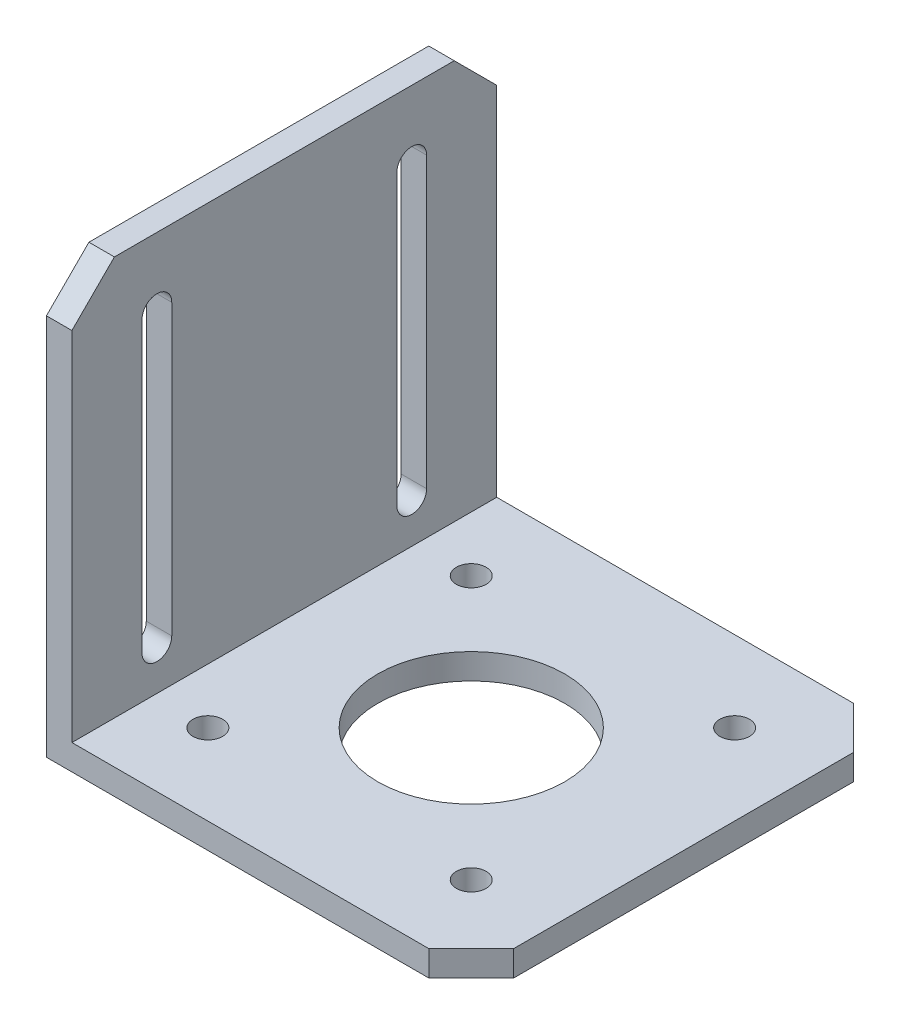
ISO-10303-21;
HEADER;
FILE_DESCRIPTION(('STEP AP214'),'2;1');
FILE_NAME('part.step','',(''),(''),'','','');
FILE_SCHEMA(('AUTOMOTIVE_DESIGN { 1 0 10303 214 1 1 1 1 }'));
ENDSEC;
DATA;
#1=APPLICATION_CONTEXT('core data for automotive mechanical design processes');
#2=APPLICATION_PROTOCOL_DEFINITION('international standard','automotive_design',2000,#1);
#3=PRODUCT_CONTEXT('',#1,'mechanical');
#4=PRODUCT('Part','Part','',(#3));
#5=PRODUCT_RELATED_PRODUCT_CATEGORY('part','',(#4));
#6=PRODUCT_DEFINITION_FORMATION('','',#4);
#7=PRODUCT_DEFINITION_CONTEXT('part definition',#1,'design');
#8=PRODUCT_DEFINITION('design','',#6,#7);
#9=PRODUCT_DEFINITION_SHAPE('','',#8);
#10=(LENGTH_UNIT() NAMED_UNIT(*) SI_UNIT(.MILLI.,.METRE.));
#11=(NAMED_UNIT(*) PLANE_ANGLE_UNIT() SI_UNIT($,.RADIAN.));
#12=(NAMED_UNIT(*) SI_UNIT($,.STERADIAN.) SOLID_ANGLE_UNIT());
#13=UNCERTAINTY_MEASURE_WITH_UNIT(LENGTH_MEASURE(1.E-05),#10,'distance_accuracy_value','');
#14=(GEOMETRIC_REPRESENTATION_CONTEXT(3) GLOBAL_UNCERTAINTY_ASSIGNED_CONTEXT((#13)) GLOBAL_UNIT_ASSIGNED_CONTEXT((#10,
#11,#12)) REPRESENTATION_CONTEXT('',''));
#15=CARTESIAN_POINT('',(0.,0.,0.));
#16=DIRECTION('',(0.,0.,1.));
#17=DIRECTION('',(1.,0.,0.));
#18=AXIS2_PLACEMENT_3D('',#15,#16,#17);
#19=CARTESIAN_POINT('',(0.,3.,0.));
#20=DIRECTION('',(0.,-1.,0.));
#21=DIRECTION('',(0.,0.,-1.));
#22=AXIS2_PLACEMENT_3D('',#19,#20,#21);
#23=PLANE('',#22);
#24=CARTESIAN_POINT('',(40.5000000000006,3.,-9.50000000000001));
#25=DIRECTION('',(0.,1.,0.));
#26=DIRECTION('',(0.,0.,1.));
#27=AXIS2_PLACEMENT_3D('',#24,#25,#26);
#28=CIRCLE('',#27,1.75);
#29=CARTESIAN_POINT('',(40.5000000000006,3.,-7.75));
#30=VERTEX_POINT('',#29);
#31=EDGE_CURVE('E244',#30,#30,#28,.T.);
#32=ORIENTED_EDGE('',*,*,#31,.F.);
#33=EDGE_LOOP('',(#32));
#34=FACE_BOUND('',#33,.T.);
#35=CARTESIAN_POINT('',(9.49999999999999,3.,-40.4999999999994));
#36=DIRECTION('',(0.,1.,0.));
#37=DIRECTION('',(0.,0.,1.));
#38=AXIS2_PLACEMENT_3D('',#35,#36,#37);
#39=CIRCLE('',#38,1.75000000000001);
#40=CARTESIAN_POINT('',(9.49999999999999,3.,-38.7499999999994));
#41=VERTEX_POINT('',#40);
#42=EDGE_CURVE('E594',#41,#41,#39,.T.);
#43=ORIENTED_EDGE('',*,*,#42,.F.);
#44=EDGE_LOOP('',(#43));
#45=FACE_BOUND('',#44,.T.);
#46=CARTESIAN_POINT('',(25.,3.,-25.));
#47=DIRECTION('',(0.,1.,0.));
#48=DIRECTION('',(0.,0.,1.));
#49=AXIS2_PLACEMENT_3D('',#46,#47,#48);
#50=CIRCLE('',#49,11.);
#51=CARTESIAN_POINT('',(25.,3.,-14.));
#52=VERTEX_POINT('',#51);
#53=EDGE_CURVE('E291',#52,#52,#50,.T.);
#54=ORIENTED_EDGE('',*,*,#53,.F.);
#55=EDGE_LOOP('',(#54));
#56=FACE_BOUND('',#55,.T.);
#57=CARTESIAN_POINT('',(40.5,3.,-40.5));
#58=DIRECTION('',(0.,1.,0.));
#59=DIRECTION('',(0.,0.,1.));
#60=AXIS2_PLACEMENT_3D('',#57,#58,#59);
#61=CIRCLE('',#60,1.75);
#62=CARTESIAN_POINT('',(40.5,3.,-38.75));
#63=VERTEX_POINT('',#62);
#64=EDGE_CURVE('E585',#63,#63,#61,.T.);
#65=ORIENTED_EDGE('',*,*,#64,.F.);
#66=EDGE_LOOP('',(#65));
#67=FACE_BOUND('',#66,.T.);
#68=CARTESIAN_POINT('',(9.50000000000058,3.,-9.49999999999942));
#69=DIRECTION('',(0.,1.,0.));
#70=DIRECTION('',(0.,0.,1.));
#71=AXIS2_PLACEMENT_3D('',#68,#69,#70);
#72=CIRCLE('',#71,1.75);
#73=CARTESIAN_POINT('',(9.50000000000058,3.,-7.74999999999942));
#74=VERTEX_POINT('',#73);
#75=EDGE_CURVE('E599',#74,#74,#72,.T.);
#76=ORIENTED_EDGE('',*,*,#75,.F.);
#77=EDGE_LOOP('',(#76));
#78=FACE_BOUND('',#77,.T.);
#79=DIRECTION('',(0.,0.,-1.));
#80=VECTOR('',#79,1.);
#81=CARTESIAN_POINT('',(50.,3.,0.));
#82=LINE('',#81,#80);
#83=CARTESIAN_POINT('',(50.,3.,-5.));
#84=VERTEX_POINT('',#83);
#85=CARTESIAN_POINT('',(50.,3.,-45.));
#86=VERTEX_POINT('',#85);
#87=EDGE_CURVE('E282',#84,#86,#82,.T.);
#88=ORIENTED_EDGE('',*,*,#87,.T.);
#89=DIRECTION('',(0.707106781186547,0.,0.707106781186549));
#90=VECTOR('',#89,1.);
#91=CARTESIAN_POINT('',(45.,3.,-50.));
#92=LINE('',#91,#90);
#93=CARTESIAN_POINT('',(45.,3.,-50.));
#94=VERTEX_POINT('',#93);
#95=EDGE_CURVE('E41',#86,#94,#92,.F.);
#96=ORIENTED_EDGE('',*,*,#95,.T.);
#97=DIRECTION('',(-1.,0.,0.));
#98=VECTOR('',#97,1.);
#99=CARTESIAN_POINT('',(0.,3.,-50.));
#100=LINE('',#99,#98);
#101=CARTESIAN_POINT('',(2.99999999999999,3.,-50.));
#102=VERTEX_POINT('',#101);
#103=EDGE_CURVE('E278',#94,#102,#100,.T.);
#104=ORIENTED_EDGE('',*,*,#103,.T.);
#105=DIRECTION('',(0.,0.,-1.));
#106=VECTOR('',#105,1.);
#107=CARTESIAN_POINT('',(2.99999999999999,3.,-50.));
#108=LINE('',#107,#106);
#109=CARTESIAN_POINT('',(2.99999999999999,3.,0.));
#110=VERTEX_POINT('',#109);
#111=EDGE_CURVE('E234',#110,#102,#108,.T.);
#112=ORIENTED_EDGE('',*,*,#111,.F.);
#113=DIRECTION('',(1.,0.,0.));
#114=VECTOR('',#113,1.);
#115=CARTESIAN_POINT('',(0.,3.,0.));
#116=LINE('',#115,#114);
#117=CARTESIAN_POINT('',(45.,3.,0.));
#118=VERTEX_POINT('',#117);
#119=EDGE_CURVE('E250',#110,#118,#116,.T.);
#120=ORIENTED_EDGE('',*,*,#119,.T.);
#121=DIRECTION('',(-0.707106781186548,0.,0.707106781186547));
#122=VECTOR('',#121,1.);
#123=CARTESIAN_POINT('',(50.,3.,-5.));
#124=LINE('',#123,#122);
#125=EDGE_CURVE('E350',#118,#84,#124,.F.);
#126=ORIENTED_EDGE('',*,*,#125,.T.);
#127=EDGE_LOOP('',(#88,#96,#104,#112,#120,#126));
#128=FACE_BOUND('',#127,.T.);
#129=ADVANCED_FACE('F33',(#34,#45,#56,#67,#78,#128),#23,.F.);
#130=CARTESIAN_POINT('',(0.,0.,0.));
#131=DIRECTION('',(0.,-1.,0.));
#132=DIRECTION('',(0.,0.,-1.));
#133=AXIS2_PLACEMENT_3D('',#130,#131,#132);
#134=PLANE('',#133);
#135=CARTESIAN_POINT('',(9.50000000000058,0.,-9.49999999999942));
#136=DIRECTION('',(0.,1.,0.));
#137=DIRECTION('',(0.,0.,1.));
#138=AXIS2_PLACEMENT_3D('',#135,#136,#137);
#139=CIRCLE('',#138,1.75);
#140=CARTESIAN_POINT('',(9.50000000000058,0.,-7.74999999999942));
#141=VERTEX_POINT('',#140);
#142=EDGE_CURVE('E602',#141,#141,#139,.T.);
#143=ORIENTED_EDGE('',*,*,#142,.T.);
#144=EDGE_LOOP('',(#143));
#145=FACE_BOUND('',#144,.T.);
#146=CARTESIAN_POINT('',(40.5,0.,-40.5));
#147=DIRECTION('',(0.,1.,0.));
#148=DIRECTION('',(0.,0.,1.));
#149=AXIS2_PLACEMENT_3D('',#146,#147,#148);
#150=CIRCLE('',#149,1.75);
#151=CARTESIAN_POINT('',(40.5,0.,-38.75));
#152=VERTEX_POINT('',#151);
#153=EDGE_CURVE('E589',#152,#152,#150,.T.);
#154=ORIENTED_EDGE('',*,*,#153,.T.);
#155=EDGE_LOOP('',(#154));
#156=FACE_BOUND('',#155,.T.);
#157=DIRECTION('',(-1.,0.,0.));
#158=VECTOR('',#157,1.);
#159=CARTESIAN_POINT('',(0.,0.,-50.));
#160=LINE('',#159,#158);
#161=CARTESIAN_POINT('',(45.,0.,-50.));
#162=VERTEX_POINT('',#161);
#163=CARTESIAN_POINT('',(0.,0.,-50.));
#164=VERTEX_POINT('',#163);
#165=EDGE_CURVE('E295',#162,#164,#160,.T.);
#166=ORIENTED_EDGE('',*,*,#165,.F.);
#167=DIRECTION('',(-0.707106781186547,0.,-0.707106781186549));
#168=VECTOR('',#167,1.);
#169=CARTESIAN_POINT('',(47.5000000000001,0.,-47.4999999999999));
#170=LINE('',#169,#168);
#171=CARTESIAN_POINT('',(50.,0.,-45.));
#172=VERTEX_POINT('',#171);
#173=EDGE_CURVE('E333',#162,#172,#170,.F.);
#174=ORIENTED_EDGE('',*,*,#173,.T.);
#175=DIRECTION('',(0.,0.,-1.));
#176=VECTOR('',#175,1.);
#177=CARTESIAN_POINT('',(50.,0.,0.));
#178=LINE('',#177,#176);
#179=CARTESIAN_POINT('',(50.,0.,-4.99999999999999));
#180=VERTEX_POINT('',#179);
#181=EDGE_CURVE('E293',#180,#172,#178,.T.);
#182=ORIENTED_EDGE('',*,*,#181,.F.);
#183=DIRECTION('',(0.707106781186548,0.,-0.707106781186547));
#184=VECTOR('',#183,1.);
#185=CARTESIAN_POINT('',(22.5,0.,22.5));
#186=LINE('',#185,#184);
#187=CARTESIAN_POINT('',(45.,0.,0.));
#188=VERTEX_POINT('',#187);
#189=EDGE_CURVE('E343',#180,#188,#186,.F.);
#190=ORIENTED_EDGE('',*,*,#189,.T.);
#191=DIRECTION('',(1.,0.,0.));
#192=VECTOR('',#191,1.);
#193=CARTESIAN_POINT('',(0.,0.,0.));
#194=LINE('',#193,#192);
#195=CARTESIAN_POINT('',(0.,0.,0.));
#196=VERTEX_POINT('',#195);
#197=EDGE_CURVE('E290',#196,#188,#194,.T.);
#198=ORIENTED_EDGE('',*,*,#197,.F.);
#199=DIRECTION('',(0.,0.,1.));
#200=VECTOR('',#199,1.);
#201=CARTESIAN_POINT('',(0.,0.,0.));
#202=LINE('',#201,#200);
#203=EDGE_CURVE('E287',#164,#196,#202,.T.);
#204=ORIENTED_EDGE('',*,*,#203,.F.);
#205=EDGE_LOOP('',(#166,#174,#182,#190,#198,#204));
#206=FACE_BOUND('',#205,.T.);
#207=CARTESIAN_POINT('',(25.,0.,-25.));
#208=DIRECTION('',(0.,1.,0.));
#209=DIRECTION('',(0.,0.,1.));
#210=AXIS2_PLACEMENT_3D('',#207,#208,#209);
#211=CIRCLE('',#210,11.);
#212=CARTESIAN_POINT('',(25.,0.,-14.));
#213=VERTEX_POINT('',#212);
#214=EDGE_CURVE('E584',#213,#213,#211,.T.);
#215=ORIENTED_EDGE('',*,*,#214,.T.);
#216=EDGE_LOOP('',(#215));
#217=FACE_BOUND('',#216,.T.);
#218=CARTESIAN_POINT('',(9.49999999999999,0.,-40.4999999999994));
#219=DIRECTION('',(0.,1.,0.));
#220=DIRECTION('',(0.,0.,1.));
#221=AXIS2_PLACEMENT_3D('',#218,#219,#220);
#222=CIRCLE('',#221,1.75000000000001);
#223=CARTESIAN_POINT('',(9.49999999999999,0.,-38.7499999999994));
#224=VERTEX_POINT('',#223);
#225=EDGE_CURVE('E596',#224,#224,#222,.T.);
#226=ORIENTED_EDGE('',*,*,#225,.T.);
#227=EDGE_LOOP('',(#226));
#228=FACE_BOUND('',#227,.T.);
#229=CARTESIAN_POINT('',(40.5000000000006,0.,-9.50000000000001));
#230=DIRECTION('',(0.,1.,0.));
#231=DIRECTION('',(0.,0.,1.));
#232=AXIS2_PLACEMENT_3D('',#229,#230,#231);
#233=CIRCLE('',#232,1.75);
#234=CARTESIAN_POINT('',(40.5000000000006,0.,-7.75));
#235=VERTEX_POINT('',#234);
#236=EDGE_CURVE('E264',#235,#235,#233,.T.);
#237=ORIENTED_EDGE('',*,*,#236,.T.);
#238=EDGE_LOOP('',(#237));
#239=FACE_BOUND('',#238,.T.);
#240=ADVANCED_FACE('F330',(#145,#156,#206,#217,#228,#239),#134,.T.);
#241=CARTESIAN_POINT('',(0.,3.,0.));
#242=DIRECTION('',(1.,0.,0.));
#243=DIRECTION('',(0.,0.,-1.));
#244=AXIS2_PLACEMENT_3D('',#241,#242,#243);
#245=PLANE('',#244);
#246=DIRECTION('',(0.,-1.,0.));
#247=VECTOR('',#246,1.);
#248=CARTESIAN_POINT('',(0.,42.,-11.75));
#249=LINE('',#248,#247);
#250=CARTESIAN_POINT('',(0.,42.,-11.75));
#251=VERTEX_POINT('',#250);
#252=CARTESIAN_POINT('',(0.,8.,-11.75));
#253=VERTEX_POINT('',#252);
#254=EDGE_CURVE('E188',#251,#253,#249,.T.);
#255=ORIENTED_EDGE('',*,*,#254,.F.);
#256=CARTESIAN_POINT('',(0.,42.,-10.));
#257=DIRECTION('',(-1.,0.,0.));
#258=DIRECTION('',(0.,0.,1.));
#259=AXIS2_PLACEMENT_3D('',#256,#257,#258);
#260=CIRCLE('',#259,1.75);
#261=CARTESIAN_POINT('',(0.,42.,-8.25));
#262=VERTEX_POINT('',#261);
#263=EDGE_CURVE('E167',#262,#251,#260,.T.);
#264=ORIENTED_EDGE('',*,*,#263,.F.);
#265=DIRECTION('',(0.,1.,0.));
#266=VECTOR('',#265,1.);
#267=CARTESIAN_POINT('',(0.,42.,-8.25));
#268=LINE('',#267,#266);
#269=CARTESIAN_POINT('',(0.,8.,-8.25));
#270=VERTEX_POINT('',#269);
#271=EDGE_CURVE('E172',#270,#262,#268,.T.);
#272=ORIENTED_EDGE('',*,*,#271,.F.);
#273=CARTESIAN_POINT('',(0.,8.,-10.));
#274=DIRECTION('',(-1.,0.,0.));
#275=DIRECTION('',(0.,0.,1.));
#276=AXIS2_PLACEMENT_3D('',#273,#274,#275);
#277=CIRCLE('',#276,1.75);
#278=EDGE_CURVE('E195',#253,#270,#277,.T.);
#279=ORIENTED_EDGE('',*,*,#278,.F.);
#280=EDGE_LOOP('',(#255,#264,#272,#279));
#281=FACE_BOUND('',#280,.T.);
#282=DIRECTION('',(0.,-1.,0.));
#283=VECTOR('',#282,1.);
#284=CARTESIAN_POINT('',(0.,42.,-41.75));
#285=LINE('',#284,#283);
#286=CARTESIAN_POINT('',(0.,42.,-41.75));
#287=VERTEX_POINT('',#286);
#288=CARTESIAN_POINT('',(0.,8.,-41.75));
#289=VERTEX_POINT('',#288);
#290=EDGE_CURVE('E213',#287,#289,#285,.T.);
#291=ORIENTED_EDGE('',*,*,#290,.F.);
#292=CARTESIAN_POINT('',(0.,42.,-40.));
#293=DIRECTION('',(-1.,0.,0.));
#294=DIRECTION('',(0.,0.,1.));
#295=AXIS2_PLACEMENT_3D('',#292,#293,#294);
#296=CIRCLE('',#295,1.75);
#297=CARTESIAN_POINT('',(0.,42.,-38.25));
#298=VERTEX_POINT('',#297);
#299=EDGE_CURVE('E211',#298,#287,#296,.T.);
#300=ORIENTED_EDGE('',*,*,#299,.F.);
#301=DIRECTION('',(0.,1.,0.));
#302=VECTOR('',#301,1.);
#303=CARTESIAN_POINT('',(0.,42.,-38.25));
#304=LINE('',#303,#302);
#305=CARTESIAN_POINT('',(0.,8.,-38.25));
#306=VERTEX_POINT('',#305);
#307=EDGE_CURVE('E219',#306,#298,#304,.T.);
#308=ORIENTED_EDGE('',*,*,#307,.F.);
#309=CARTESIAN_POINT('',(0.,8.,-40.));
#310=DIRECTION('',(-1.,0.,0.));
#311=DIRECTION('',(0.,0.,1.));
#312=AXIS2_PLACEMENT_3D('',#309,#310,#311);
#313=CIRCLE('',#312,1.75);
#314=EDGE_CURVE('E216',#289,#306,#313,.T.);
#315=ORIENTED_EDGE('',*,*,#314,.F.);
#316=EDGE_LOOP('',(#291,#300,#308,#315));
#317=FACE_BOUND('',#316,.T.);
#318=DIRECTION('',(0.,-1.,0.));
#319=VECTOR('',#318,1.);
#320=CARTESIAN_POINT('',(0.,3.,0.));
#321=LINE('',#320,#319);
#322=CARTESIAN_POINT('',(0.,45.,0.));
#323=VERTEX_POINT('',#322);
#324=EDGE_CURVE('E298',#323,#196,#321,.T.);
#325=ORIENTED_EDGE('',*,*,#324,.F.);
#326=DIRECTION('',(0.,0.707106781186548,-0.707106781186547));
#327=VECTOR('',#326,1.);
#328=CARTESIAN_POINT('',(0.,50.,-5.00000000000002));
#329=LINE('',#328,#327);
#330=CARTESIAN_POINT('',(0.,50.,-5.00000000000001));
#331=VERTEX_POINT('',#330);
#332=EDGE_CURVE('E273',#323,#331,#329,.T.);
#333=ORIENTED_EDGE('',*,*,#332,.T.);
#334=DIRECTION('',(0.,0.,1.));
#335=VECTOR('',#334,1.);
#336=CARTESIAN_POINT('',(0.,50.,-50.));
#337=LINE('',#336,#335);
#338=CARTESIAN_POINT('',(0.,50.,-45.));
#339=VERTEX_POINT('',#338);
#340=EDGE_CURVE('E235',#339,#331,#337,.T.);
#341=ORIENTED_EDGE('',*,*,#340,.F.);
#342=DIRECTION('',(0.,-0.70710678118655,-0.707106781186545));
#343=VECTOR('',#342,1.);
#344=CARTESIAN_POINT('',(0.,50.,-45.));
#345=LINE('',#344,#343);
#346=CARTESIAN_POINT('',(0.,45.,-50.));
#347=VERTEX_POINT('',#346);
#348=EDGE_CURVE('E271',#339,#347,#345,.T.);
#349=ORIENTED_EDGE('',*,*,#348,.T.);
#350=DIRECTION('',(0.,-1.,0.));
#351=VECTOR('',#350,1.);
#352=CARTESIAN_POINT('',(0.,3.,-50.));
#353=LINE('',#352,#351);
#354=EDGE_CURVE('E281',#347,#164,#353,.T.);
#355=ORIENTED_EDGE('',*,*,#354,.T.);
#356=ORIENTED_EDGE('',*,*,#203,.T.);
#357=EDGE_LOOP('',(#325,#333,#341,#349,#355,#356));
#358=FACE_BOUND('',#357,.T.);
#359=ADVANCED_FACE('F321',(#281,#317,#358),#245,.F.);
#360=CARTESIAN_POINT('',(0.,3.,0.));
#361=DIRECTION('',(0.,0.,-1.));
#362=DIRECTION('',(-1.,0.,0.));
#363=AXIS2_PLACEMENT_3D('',#360,#361,#362);
#364=PLANE('',#363);
#365=ORIENTED_EDGE('',*,*,#197,.T.);
#366=DIRECTION('',(0.,1.,0.));
#367=VECTOR('',#366,1.);
#368=CARTESIAN_POINT('',(45.,3.,0.));
#369=LINE('',#368,#367);
#370=EDGE_CURVE('E11',#188,#118,#369,.T.);
#371=ORIENTED_EDGE('',*,*,#370,.T.);
#372=ORIENTED_EDGE('',*,*,#119,.F.);
#373=DIRECTION('',(0.,-1.,0.));
#374=VECTOR('',#373,1.);
#375=CARTESIAN_POINT('',(2.99999999999999,50.,0.));
#376=LINE('',#375,#374);
#377=CARTESIAN_POINT('',(2.99999999999999,45.,0.));
#378=VERTEX_POINT('',#377);
#379=EDGE_CURVE('E261',#378,#110,#376,.T.);
#380=ORIENTED_EDGE('',*,*,#379,.F.);
#381=DIRECTION('',(-1.,0.,0.));
#382=VECTOR('',#381,1.);
#383=CARTESIAN_POINT('',(0.,45.,0.));
#384=LINE('',#383,#382);
#385=EDGE_CURVE('E269',#378,#323,#384,.T.);
#386=ORIENTED_EDGE('',*,*,#385,.T.);
#387=ORIENTED_EDGE('',*,*,#324,.T.);
#388=EDGE_LOOP('',(#365,#371,#372,#380,#386,#387));
#389=FACE_BOUND('',#388,.T.);
#390=ADVANCED_FACE('F336',(#389),#364,.F.);
#391=CARTESIAN_POINT('',(50.,3.,0.));
#392=DIRECTION('',(-1.,0.,0.));
#393=DIRECTION('',(0.,0.,1.));
#394=AXIS2_PLACEMENT_3D('',#391,#392,#393);
#395=PLANE('',#394);
#396=ORIENTED_EDGE('',*,*,#181,.T.);
#397=DIRECTION('',(0.,1.,0.));
#398=VECTOR('',#397,1.);
#399=CARTESIAN_POINT('',(50.,3.,-45.));
#400=LINE('',#399,#398);
#401=EDGE_CURVE('E54',#172,#86,#400,.T.);
#402=ORIENTED_EDGE('',*,*,#401,.T.);
#403=ORIENTED_EDGE('',*,*,#87,.F.);
#404=DIRECTION('',(0.,-1.,0.));
#405=VECTOR('',#404,1.);
#406=CARTESIAN_POINT('',(50.,3.,-5.));
#407=LINE('',#406,#405);
#408=EDGE_CURVE('E344',#84,#180,#407,.T.);
#409=ORIENTED_EDGE('',*,*,#408,.T.);
#410=EDGE_LOOP('',(#396,#402,#403,#409));
#411=FACE_BOUND('',#410,.T.);
#412=ADVANCED_FACE('F353',(#411),#395,.F.);
#413=CARTESIAN_POINT('',(0.,3.,-50.));
#414=DIRECTION('',(0.,0.,1.));
#415=DIRECTION('',(1.,0.,0.));
#416=AXIS2_PLACEMENT_3D('',#413,#414,#415);
#417=PLANE('',#416);
#418=ORIENTED_EDGE('',*,*,#103,.F.);
#419=DIRECTION('',(0.,-1.,0.));
#420=VECTOR('',#419,1.);
#421=CARTESIAN_POINT('',(45.,3.,-50.));
#422=LINE('',#421,#420);
#423=EDGE_CURVE('E277',#94,#162,#422,.T.);
#424=ORIENTED_EDGE('',*,*,#423,.T.);
#425=ORIENTED_EDGE('',*,*,#165,.T.);
#426=ORIENTED_EDGE('',*,*,#354,.F.);
#427=DIRECTION('',(1.,0.,0.));
#428=VECTOR('',#427,1.);
#429=CARTESIAN_POINT('',(2.99999999999999,45.,-50.));
#430=LINE('',#429,#428);
#431=CARTESIAN_POINT('',(2.99999999999999,45.,-50.));
#432=VERTEX_POINT('',#431);
#433=EDGE_CURVE('E275',#347,#432,#430,.T.);
#434=ORIENTED_EDGE('',*,*,#433,.T.);
#435=DIRECTION('',(0.,-1.,0.));
#436=VECTOR('',#435,1.);
#437=CARTESIAN_POINT('',(2.99999999999999,50.,-50.));
#438=LINE('',#437,#436);
#439=EDGE_CURVE('E241',#432,#102,#438,.T.);
#440=ORIENTED_EDGE('',*,*,#439,.T.);
#441=EDGE_LOOP('',(#418,#424,#425,#426,#434,#440));
#442=FACE_BOUND('',#441,.T.);
#443=ADVANCED_FACE('F325',(#442),#417,.F.);
#444=CARTESIAN_POINT('',(25.,3.,-25.));
#445=DIRECTION('',(0.,-1.,0.));
#446=DIRECTION('',(0.,0.,-1.));
#447=AXIS2_PLACEMENT_3D('',#444,#445,#446);
#448=CYLINDRICAL_SURFACE('',#447,11.);
#449=ORIENTED_EDGE('',*,*,#53,.T.);
#450=EDGE_LOOP('',(#449));
#451=FACE_BOUND('',#450,.T.);
#452=ORIENTED_EDGE('',*,*,#214,.F.);
#453=EDGE_LOOP('',(#452));
#454=FACE_BOUND('',#453,.T.);
#455=ADVANCED_FACE('F369',(#451,#454),#448,.F.);
#456=CARTESIAN_POINT('',(40.5,3.,-40.5));
#457=DIRECTION('',(0.,-1.,0.));
#458=DIRECTION('',(0.,0.,-1.));
#459=AXIS2_PLACEMENT_3D('',#456,#457,#458);
#460=CYLINDRICAL_SURFACE('',#459,1.75);
#461=ORIENTED_EDGE('',*,*,#64,.T.);
#462=EDGE_LOOP('',(#461));
#463=FACE_BOUND('',#462,.T.);
#464=ORIENTED_EDGE('',*,*,#153,.F.);
#465=EDGE_LOOP('',(#464));
#466=FACE_BOUND('',#465,.T.);
#467=ADVANCED_FACE('F557',(#463,#466),#460,.F.);
#468=CARTESIAN_POINT('',(9.49999999999999,3.,-40.4999999999994));
#469=DIRECTION('',(0.,-1.,0.));
#470=DIRECTION('',(0.,0.,-1.));
#471=AXIS2_PLACEMENT_3D('',#468,#469,#470);
#472=CYLINDRICAL_SURFACE('',#471,1.75000000000001);
#473=ORIENTED_EDGE('',*,*,#42,.T.);
#474=EDGE_LOOP('',(#473));
#475=FACE_BOUND('',#474,.T.);
#476=ORIENTED_EDGE('',*,*,#225,.F.);
#477=EDGE_LOOP('',(#476));
#478=FACE_BOUND('',#477,.T.);
#479=ADVANCED_FACE('F547',(#475,#478),#472,.F.);
#480=CARTESIAN_POINT('',(9.50000000000058,3.,-9.49999999999942));
#481=DIRECTION('',(0.,-1.,0.));
#482=DIRECTION('',(0.,0.,-1.));
#483=AXIS2_PLACEMENT_3D('',#480,#481,#482);
#484=CYLINDRICAL_SURFACE('',#483,1.75);
#485=ORIENTED_EDGE('',*,*,#75,.T.);
#486=EDGE_LOOP('',(#485));
#487=FACE_BOUND('',#486,.T.);
#488=ORIENTED_EDGE('',*,*,#142,.F.);
#489=EDGE_LOOP('',(#488));
#490=FACE_BOUND('',#489,.T.);
#491=ADVANCED_FACE('F540',(#487,#490),#484,.F.);
#492=CARTESIAN_POINT('',(40.5000000000006,3.,-9.50000000000001));
#493=DIRECTION('',(0.,-1.,0.));
#494=DIRECTION('',(0.,0.,-1.));
#495=AXIS2_PLACEMENT_3D('',#492,#493,#494);
#496=CYLINDRICAL_SURFACE('',#495,1.75);
#497=ORIENTED_EDGE('',*,*,#31,.T.);
#498=EDGE_LOOP('',(#497));
#499=FACE_BOUND('',#498,.T.);
#500=ORIENTED_EDGE('',*,*,#236,.F.);
#501=EDGE_LOOP('',(#500));
#502=FACE_BOUND('',#501,.T.);
#503=ADVANCED_FACE('F436',(#499,#502),#496,.F.);
#504=CARTESIAN_POINT('',(2.99999999999999,50.,-50.));
#505=DIRECTION('',(-1.,0.,0.));
#506=DIRECTION('',(0.,0.,1.));
#507=AXIS2_PLACEMENT_3D('',#504,#505,#506);
#508=PLANE('',#507);
#509=DIRECTION('',(0.,-1.,0.));
#510=VECTOR('',#509,1.);
#511=CARTESIAN_POINT('',(3.,42.,-8.25));
#512=LINE('',#511,#510);
#513=CARTESIAN_POINT('',(3.,42.,-8.25));
#514=VERTEX_POINT('',#513);
#515=CARTESIAN_POINT('',(3.,8.,-8.25));
#516=VERTEX_POINT('',#515);
#517=EDGE_CURVE('E186',#514,#516,#512,.T.);
#518=ORIENTED_EDGE('',*,*,#517,.F.);
#519=CARTESIAN_POINT('',(3.,42.,-10.));
#520=DIRECTION('',(-1.,0.,0.));
#521=DIRECTION('',(0.,0.,1.));
#522=AXIS2_PLACEMENT_3D('',#519,#520,#521);
#523=CIRCLE('',#522,1.75);
#524=CARTESIAN_POINT('',(3.,42.,-11.75));
#525=VERTEX_POINT('',#524);
#526=EDGE_CURVE('E164',#525,#514,#523,.F.);
#527=ORIENTED_EDGE('',*,*,#526,.F.);
#528=DIRECTION('',(0.,1.,0.));
#529=VECTOR('',#528,1.);
#530=CARTESIAN_POINT('',(3.,42.,-11.75));
#531=LINE('',#530,#529);
#532=CARTESIAN_POINT('',(2.99999999999999,8.,-11.75));
#533=VERTEX_POINT('',#532);
#534=EDGE_CURVE('E176',#533,#525,#531,.T.);
#535=ORIENTED_EDGE('',*,*,#534,.F.);
#536=CARTESIAN_POINT('',(3.,8.,-10.));
#537=DIRECTION('',(-1.,0.,0.));
#538=DIRECTION('',(0.,0.,1.));
#539=AXIS2_PLACEMENT_3D('',#536,#537,#538);
#540=CIRCLE('',#539,1.75);
#541=EDGE_CURVE('E190',#516,#533,#540,.F.);
#542=ORIENTED_EDGE('',*,*,#541,.F.);
#543=EDGE_LOOP('',(#518,#527,#535,#542));
#544=FACE_BOUND('',#543,.T.);
#545=DIRECTION('',(0.,-1.,0.));
#546=VECTOR('',#545,1.);
#547=CARTESIAN_POINT('',(2.99999999999999,42.,-38.25));
#548=LINE('',#547,#546);
#549=CARTESIAN_POINT('',(2.99999999999999,42.,-38.25));
#550=VERTEX_POINT('',#549);
#551=CARTESIAN_POINT('',(2.99999999999999,8.,-38.25));
#552=VERTEX_POINT('',#551);
#553=EDGE_CURVE('E205',#550,#552,#548,.T.);
#554=ORIENTED_EDGE('',*,*,#553,.F.);
#555=CARTESIAN_POINT('',(2.99999999999999,42.,-40.));
#556=DIRECTION('',(-1.,0.,0.));
#557=DIRECTION('',(0.,0.,1.));
#558=AXIS2_PLACEMENT_3D('',#555,#556,#557);
#559=CIRCLE('',#558,1.75);
#560=CARTESIAN_POINT('',(2.99999999999999,42.,-41.75));
#561=VERTEX_POINT('',#560);
#562=EDGE_CURVE('E208',#561,#550,#559,.F.);
#563=ORIENTED_EDGE('',*,*,#562,.F.);
#564=DIRECTION('',(0.,1.,0.));
#565=VECTOR('',#564,1.);
#566=CARTESIAN_POINT('',(2.99999999999999,42.,-41.75));
#567=LINE('',#566,#565);
#568=CARTESIAN_POINT('',(2.99999999999999,8.,-41.75));
#569=VERTEX_POINT('',#568);
#570=EDGE_CURVE('E225',#569,#561,#567,.T.);
#571=ORIENTED_EDGE('',*,*,#570,.F.);
#572=CARTESIAN_POINT('',(2.99999999999999,8.,-40.));
#573=DIRECTION('',(-1.,0.,0.));
#574=DIRECTION('',(0.,0.,1.));
#575=AXIS2_PLACEMENT_3D('',#572,#573,#574);
#576=CIRCLE('',#575,1.75);
#577=EDGE_CURVE('E180',#552,#569,#576,.F.);
#578=ORIENTED_EDGE('',*,*,#577,.F.);
#579=EDGE_LOOP('',(#554,#563,#571,#578));
#580=FACE_BOUND('',#579,.T.);
#581=DIRECTION('',(0.,0.,-1.));
#582=VECTOR('',#581,1.);
#583=CARTESIAN_POINT('',(2.99999999999999,50.,-50.));
#584=LINE('',#583,#582);
#585=CARTESIAN_POINT('',(2.99999999999999,50.,-5.00000000000001));
#586=VERTEX_POINT('',#585);
#587=CARTESIAN_POINT('',(2.99999999999999,50.,-45.));
#588=VERTEX_POINT('',#587);
#589=EDGE_CURVE('E238',#586,#588,#584,.T.);
#590=ORIENTED_EDGE('',*,*,#589,.F.);
#591=DIRECTION('',(0.,-0.707106781186548,0.707106781186547));
#592=VECTOR('',#591,1.);
#593=CARTESIAN_POINT('',(2.99999999999999,50.,-5.00000000000002));
#594=LINE('',#593,#592);
#595=EDGE_CURVE('E267',#586,#378,#594,.T.);
#596=ORIENTED_EDGE('',*,*,#595,.T.);
#597=ORIENTED_EDGE('',*,*,#379,.T.);
#598=ORIENTED_EDGE('',*,*,#111,.T.);
#599=ORIENTED_EDGE('',*,*,#439,.F.);
#600=DIRECTION('',(0.,0.70710678118655,0.707106781186545));
#601=VECTOR('',#600,1.);
#602=CARTESIAN_POINT('',(2.99999999999999,50.,-45.));
#603=LINE('',#602,#601);
#604=EDGE_CURVE('E265',#432,#588,#603,.T.);
#605=ORIENTED_EDGE('',*,*,#604,.T.);
#606=EDGE_LOOP('',(#590,#596,#597,#598,#599,#605));
#607=FACE_BOUND('',#606,.T.);
#608=ADVANCED_FACE('F183',(#544,#580,#607),#508,.F.);
#609=CARTESIAN_POINT('',(0.,50.,0.));
#610=DIRECTION('',(0.,1.,0.));
#611=DIRECTION('',(0.,0.,1.));
#612=AXIS2_PLACEMENT_3D('',#609,#610,#611);
#613=PLANE('',#612);
#614=ORIENTED_EDGE('',*,*,#340,.T.);
#615=DIRECTION('',(1.,0.,0.));
#616=VECTOR('',#615,1.);
#617=CARTESIAN_POINT('',(2.99999999999999,50.,-5.00000000000002));
#618=LINE('',#617,#616);
#619=EDGE_CURVE('E262',#331,#586,#618,.T.);
#620=ORIENTED_EDGE('',*,*,#619,.T.);
#621=ORIENTED_EDGE('',*,*,#589,.T.);
#622=DIRECTION('',(-1.,0.,0.));
#623=VECTOR('',#622,1.);
#624=CARTESIAN_POINT('',(0.,50.,-45.));
#625=LINE('',#624,#623);
#626=EDGE_CURVE('E299',#588,#339,#625,.T.);
#627=ORIENTED_EDGE('',*,*,#626,.T.);
#628=EDGE_LOOP('',(#614,#620,#621,#627));
#629=FACE_BOUND('',#628,.T.);
#630=ADVANCED_FACE('F309',(#629),#613,.T.);
#631=CARTESIAN_POINT('',(50.001025,42.,-40.));
#632=DIRECTION('',(-1.,0.,0.));
#633=DIRECTION('',(0.,0.,1.));
#634=AXIS2_PLACEMENT_3D('',#631,#632,#633);
#635=CYLINDRICAL_SURFACE('',#634,1.75);
#636=ORIENTED_EDGE('',*,*,#562,.T.);
#637=DIRECTION('',(-1.,0.,0.));
#638=VECTOR('',#637,1.);
#639=CARTESIAN_POINT('',(50.001025,42.,-38.25));
#640=LINE('',#639,#638);
#641=EDGE_CURVE('E223',#550,#298,#640,.T.);
#642=ORIENTED_EDGE('',*,*,#641,.T.);
#643=ORIENTED_EDGE('',*,*,#299,.T.);
#644=DIRECTION('',(-1.,0.,0.));
#645=VECTOR('',#644,1.);
#646=CARTESIAN_POINT('',(50.001025,42.,-41.75));
#647=LINE('',#646,#645);
#648=EDGE_CURVE('E222',#561,#287,#647,.T.);
#649=ORIENTED_EDGE('',*,*,#648,.F.);
#650=EDGE_LOOP('',(#636,#642,#643,#649));
#651=FACE_BOUND('',#650,.T.);
#652=ADVANCED_FACE('F464',(#651),#635,.F.);
#653=CARTESIAN_POINT('',(50.001025,42.,-38.25));
#654=DIRECTION('',(0.,0.,1.));
#655=DIRECTION('',(0.,-1.,0.));
#656=AXIS2_PLACEMENT_3D('',#653,#654,#655);
#657=PLANE('',#656);
#658=ORIENTED_EDGE('',*,*,#553,.T.);
#659=DIRECTION('',(-1.,0.,0.));
#660=VECTOR('',#659,1.);
#661=CARTESIAN_POINT('',(50.001025,8.,-38.25));
#662=LINE('',#661,#660);
#663=EDGE_CURVE('E226',#552,#306,#662,.T.);
#664=ORIENTED_EDGE('',*,*,#663,.T.);
#665=ORIENTED_EDGE('',*,*,#307,.T.);
#666=ORIENTED_EDGE('',*,*,#641,.F.);
#667=EDGE_LOOP('',(#658,#664,#665,#666));
#668=FACE_BOUND('',#667,.T.);
#669=ADVANCED_FACE('F520',(#668),#657,.F.);
#670=CARTESIAN_POINT('',(50.001025,8.,-40.));
#671=DIRECTION('',(-1.,0.,0.));
#672=DIRECTION('',(0.,0.,1.));
#673=AXIS2_PLACEMENT_3D('',#670,#671,#672);
#674=CYLINDRICAL_SURFACE('',#673,1.75);
#675=ORIENTED_EDGE('',*,*,#577,.T.);
#676=DIRECTION('',(-1.,0.,0.));
#677=VECTOR('',#676,1.);
#678=CARTESIAN_POINT('',(50.001025,8.,-41.75));
#679=LINE('',#678,#677);
#680=EDGE_CURVE('E228',#569,#289,#679,.T.);
#681=ORIENTED_EDGE('',*,*,#680,.T.);
#682=ORIENTED_EDGE('',*,*,#314,.T.);
#683=ORIENTED_EDGE('',*,*,#663,.F.);
#684=EDGE_LOOP('',(#675,#681,#682,#683));
#685=FACE_BOUND('',#684,.T.);
#686=ADVANCED_FACE('F511',(#685),#674,.F.);
#687=CARTESIAN_POINT('',(50.001025,42.,-41.75));
#688=DIRECTION('',(0.,0.,-1.));
#689=DIRECTION('',(0.,1.,0.));
#690=AXIS2_PLACEMENT_3D('',#687,#688,#689);
#691=PLANE('',#690);
#692=ORIENTED_EDGE('',*,*,#570,.T.);
#693=ORIENTED_EDGE('',*,*,#648,.T.);
#694=ORIENTED_EDGE('',*,*,#290,.T.);
#695=ORIENTED_EDGE('',*,*,#680,.F.);
#696=EDGE_LOOP('',(#692,#693,#694,#695));
#697=FACE_BOUND('',#696,.T.);
#698=ADVANCED_FACE('F503',(#697),#691,.F.);
#699=CARTESIAN_POINT('',(50.001025,42.,-10.));
#700=DIRECTION('',(-1.,0.,0.));
#701=DIRECTION('',(0.,0.,1.));
#702=AXIS2_PLACEMENT_3D('',#699,#700,#701);
#703=CYLINDRICAL_SURFACE('',#702,1.75);
#704=ORIENTED_EDGE('',*,*,#526,.T.);
#705=DIRECTION('',(-1.,0.,0.));
#706=VECTOR('',#705,1.);
#707=CARTESIAN_POINT('',(50.001025,42.,-8.25000000000002));
#708=LINE('',#707,#706);
#709=EDGE_CURVE('E181',#514,#262,#708,.T.);
#710=ORIENTED_EDGE('',*,*,#709,.T.);
#711=ORIENTED_EDGE('',*,*,#263,.T.);
#712=DIRECTION('',(-1.,0.,0.));
#713=VECTOR('',#712,1.);
#714=CARTESIAN_POINT('',(50.001025,42.,-11.75));
#715=LINE('',#714,#713);
#716=EDGE_CURVE('E160',#525,#251,#715,.T.);
#717=ORIENTED_EDGE('',*,*,#716,.F.);
#718=EDGE_LOOP('',(#704,#710,#711,#717));
#719=FACE_BOUND('',#718,.T.);
#720=ADVANCED_FACE('F162',(#719),#703,.F.);
#721=CARTESIAN_POINT('',(50.001025,42.,-8.25000000000002));
#722=DIRECTION('',(0.,0.,1.));
#723=DIRECTION('',(1.,0.,0.));
#724=AXIS2_PLACEMENT_3D('',#721,#722,#723);
#725=PLANE('',#724);
#726=ORIENTED_EDGE('',*,*,#517,.T.);
#727=DIRECTION('',(-1.,0.,0.));
#728=VECTOR('',#727,1.);
#729=CARTESIAN_POINT('',(50.001025,8.,-8.25000000000002));
#730=LINE('',#729,#728);
#731=EDGE_CURVE('E201',#516,#270,#730,.T.);
#732=ORIENTED_EDGE('',*,*,#731,.T.);
#733=ORIENTED_EDGE('',*,*,#271,.T.);
#734=ORIENTED_EDGE('',*,*,#709,.F.);
#735=EDGE_LOOP('',(#726,#732,#733,#734));
#736=FACE_BOUND('',#735,.T.);
#737=ADVANCED_FACE('F486',(#736),#725,.F.);
#738=CARTESIAN_POINT('',(50.001025,8.,-10.));
#739=DIRECTION('',(-1.,0.,0.));
#740=DIRECTION('',(0.,0.,1.));
#741=AXIS2_PLACEMENT_3D('',#738,#739,#740);
#742=CYLINDRICAL_SURFACE('',#741,1.75);
#743=ORIENTED_EDGE('',*,*,#541,.T.);
#744=DIRECTION('',(-1.,0.,0.));
#745=VECTOR('',#744,1.);
#746=CARTESIAN_POINT('',(50.001025,8.,-11.75));
#747=LINE('',#746,#745);
#748=EDGE_CURVE('E171',#533,#253,#747,.T.);
#749=ORIENTED_EDGE('',*,*,#748,.T.);
#750=ORIENTED_EDGE('',*,*,#278,.T.);
#751=ORIENTED_EDGE('',*,*,#731,.F.);
#752=EDGE_LOOP('',(#743,#749,#750,#751));
#753=FACE_BOUND('',#752,.T.);
#754=ADVANCED_FACE('F480',(#753),#742,.F.);
#755=CARTESIAN_POINT('',(50.001025,42.,-11.75));
#756=DIRECTION('',(0.,0.,-1.));
#757=DIRECTION('',(-1.,0.,0.));
#758=AXIS2_PLACEMENT_3D('',#755,#756,#757);
#759=PLANE('',#758);
#760=ORIENTED_EDGE('',*,*,#534,.T.);
#761=ORIENTED_EDGE('',*,*,#716,.T.);
#762=ORIENTED_EDGE('',*,*,#254,.T.);
#763=ORIENTED_EDGE('',*,*,#748,.F.);
#764=EDGE_LOOP('',(#760,#761,#762,#763));
#765=FACE_BOUND('',#764,.T.);
#766=ADVANCED_FACE('F177',(#765),#759,.F.);
#767=CARTESIAN_POINT('',(0.,50.,-5.00000000000002));
#768=DIRECTION('',(0.,0.707106781186547,0.707106781186548));
#769=DIRECTION('',(-1.,0.,0.));
#770=AXIS2_PLACEMENT_3D('',#767,#768,#769);
#771=PLANE('',#770);
#772=ORIENTED_EDGE('',*,*,#332,.F.);
#773=ORIENTED_EDGE('',*,*,#385,.F.);
#774=ORIENTED_EDGE('',*,*,#595,.F.);
#775=ORIENTED_EDGE('',*,*,#619,.F.);
#776=EDGE_LOOP('',(#772,#773,#774,#775));
#777=FACE_BOUND('',#776,.T.);
#778=ADVANCED_FACE('F335',(#777),#771,.T.);
#779=CARTESIAN_POINT('',(0.,50.,-45.));
#780=DIRECTION('',(0.,0.707106781186545,-0.70710678118655));
#781=DIRECTION('',(1.,0.,0.));
#782=AXIS2_PLACEMENT_3D('',#779,#780,#781);
#783=PLANE('',#782);
#784=ORIENTED_EDGE('',*,*,#604,.F.);
#785=ORIENTED_EDGE('',*,*,#433,.F.);
#786=ORIENTED_EDGE('',*,*,#348,.F.);
#787=ORIENTED_EDGE('',*,*,#626,.F.);
#788=EDGE_LOOP('',(#784,#785,#786,#787));
#789=FACE_BOUND('',#788,.T.);
#790=ADVANCED_FACE('F318',(#789),#783,.T.);
#791=CARTESIAN_POINT('',(45.,3.,-50.));
#792=DIRECTION('',(-0.707106781186548,0.,0.707106781186546));
#793=DIRECTION('',(0.,-1.,0.));
#794=AXIS2_PLACEMENT_3D('',#791,#792,#793);
#795=PLANE('',#794);
#796=ORIENTED_EDGE('',*,*,#95,.F.);
#797=ORIENTED_EDGE('',*,*,#401,.F.);
#798=ORIENTED_EDGE('',*,*,#173,.F.);
#799=ORIENTED_EDGE('',*,*,#423,.F.);
#800=EDGE_LOOP('',(#796,#797,#798,#799));
#801=FACE_BOUND('',#800,.T.);
#802=ADVANCED_FACE('F342',(#801),#795,.F.);
#803=CARTESIAN_POINT('',(50.,3.,-5.));
#804=DIRECTION('',(-0.707106781186547,0.,-0.707106781186548));
#805=DIRECTION('',(0.,-1.,0.));
#806=AXIS2_PLACEMENT_3D('',#803,#804,#805);
#807=PLANE('',#806);
#808=ORIENTED_EDGE('',*,*,#125,.F.);
#809=ORIENTED_EDGE('',*,*,#370,.F.);
#810=ORIENTED_EDGE('',*,*,#189,.F.);
#811=ORIENTED_EDGE('',*,*,#408,.F.);
#812=EDGE_LOOP('',(#808,#809,#810,#811));
#813=FACE_BOUND('',#812,.T.);
#814=ADVANCED_FACE('F35',(#813),#807,.F.);
#815=CLOSED_SHELL('',(#129,#240,#359,#390,#412,#443,#455,#467,#479,#491,#503,#608,#630,#652,
#669,#686,#698,#720,#737,#754,#766,#778,#790,#802,#814));
#816=MANIFOLD_SOLID_BREP('B2',#815);
#817=ADVANCED_BREP_SHAPE_REPRESENTATION('',(#18,#816),#14);
#818=SHAPE_DEFINITION_REPRESENTATION(#9,#817);
ENDSEC;
END-ISO-10303-21;
